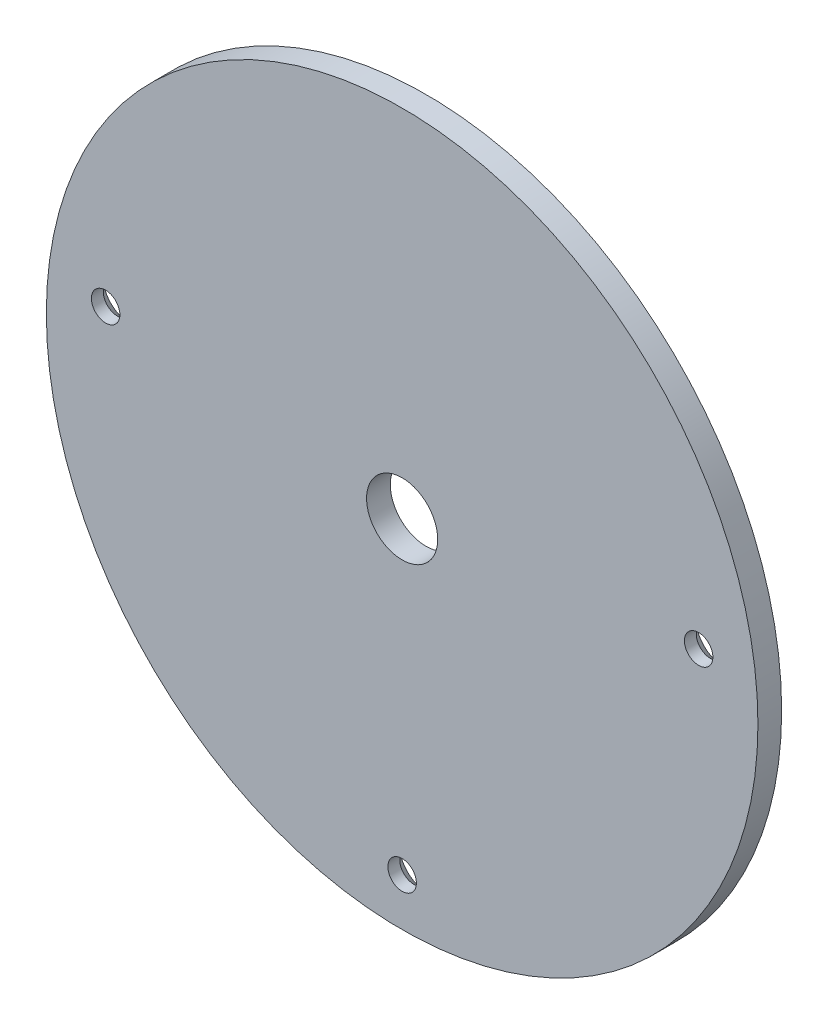
ISO-10303-21;
HEADER;
FILE_DESCRIPTION(('STEP AP214'),'2;1');
FILE_NAME('part.step','',(''),(''),'','','');
FILE_SCHEMA(('AUTOMOTIVE_DESIGN { 1 0 10303 214 1 1 1 1 }'));
ENDSEC;
DATA;
#1=APPLICATION_CONTEXT('core data for automotive mechanical design processes');
#2=APPLICATION_PROTOCOL_DEFINITION('international standard','automotive_design',2000,#1);
#3=PRODUCT_CONTEXT('',#1,'mechanical');
#4=PRODUCT('Part','Part','',(#3));
#5=PRODUCT_RELATED_PRODUCT_CATEGORY('part','',(#4));
#6=PRODUCT_DEFINITION_FORMATION('','',#4);
#7=PRODUCT_DEFINITION_CONTEXT('part definition',#1,'design');
#8=PRODUCT_DEFINITION('design','',#6,#7);
#9=PRODUCT_DEFINITION_SHAPE('','',#8);
#10=(LENGTH_UNIT() NAMED_UNIT(*) SI_UNIT(.MILLI.,.METRE.));
#11=(NAMED_UNIT(*) PLANE_ANGLE_UNIT() SI_UNIT($,.RADIAN.));
#12=(NAMED_UNIT(*) SI_UNIT($,.STERADIAN.) SOLID_ANGLE_UNIT());
#13=UNCERTAINTY_MEASURE_WITH_UNIT(LENGTH_MEASURE(1.E-05),#10,'distance_accuracy_value','');
#14=(GEOMETRIC_REPRESENTATION_CONTEXT(3) GLOBAL_UNCERTAINTY_ASSIGNED_CONTEXT((#13)) GLOBAL_UNIT_ASSIGNED_CONTEXT((#10,
#11,#12)) REPRESENTATION_CONTEXT('',''));
#15=CARTESIAN_POINT('',(0.,0.,0.));
#16=DIRECTION('',(0.,0.,1.));
#17=DIRECTION('',(1.,0.,0.));
#18=AXIS2_PLACEMENT_3D('',#15,#16,#17);
#19=CARTESIAN_POINT('',(0.,0.,2.));
#20=DIRECTION('',(0.,0.,1.));
#21=DIRECTION('',(1.,0.,0.));
#22=AXIS2_PLACEMENT_3D('',#19,#20,#21);
#23=PLANE('',#22);
#24=CARTESIAN_POINT('',(0.,-26.,2.));
#25=DIRECTION('',(0.,0.,1.));
#26=DIRECTION('',(1.,0.,0.));
#27=AXIS2_PLACEMENT_3D('',#24,#25,#26);
#28=CIRCLE('',#27,1.19999999999999);
#29=CARTESIAN_POINT('',(1.19999999999998,-26.,2.));
#30=VERTEX_POINT('',#29);
#31=EDGE_CURVE('E41',#30,#30,#28,.T.);
#32=ORIENTED_EDGE('',*,*,#31,.F.);
#33=EDGE_LOOP('',(#32));
#34=FACE_BOUND('',#33,.T.);
#35=CARTESIAN_POINT('',(25.,3.,2.));
#36=DIRECTION('',(0.,0.,1.));
#37=DIRECTION('',(1.,0.,0.));
#38=AXIS2_PLACEMENT_3D('',#35,#36,#37);
#39=CIRCLE('',#38,1.19999999999999);
#40=CARTESIAN_POINT('',(26.2,3.,2.));
#41=VERTEX_POINT('',#40);
#42=EDGE_CURVE('E62',#41,#41,#39,.T.);
#43=ORIENTED_EDGE('',*,*,#42,.F.);
#44=EDGE_LOOP('',(#43));
#45=FACE_BOUND('',#44,.T.);
#46=CARTESIAN_POINT('',(-25.,3.00000000000001,2.));
#47=DIRECTION('',(0.,0.,1.));
#48=DIRECTION('',(1.,0.,0.));
#49=AXIS2_PLACEMENT_3D('',#46,#47,#48);
#50=CIRCLE('',#49,1.19999999999999);
#51=CARTESIAN_POINT('',(-23.8,3.00000000000001,2.));
#52=VERTEX_POINT('',#51);
#53=EDGE_CURVE('E58',#52,#52,#50,.T.);
#54=ORIENTED_EDGE('',*,*,#53,.F.);
#55=EDGE_LOOP('',(#54));
#56=FACE_BOUND('',#55,.T.);
#57=CARTESIAN_POINT('',(0.,0.,2.));
#58=DIRECTION('',(0.,0.,1.));
#59=DIRECTION('',(1.,0.,0.));
#60=AXIS2_PLACEMENT_3D('',#57,#58,#59);
#61=CIRCLE('',#60,30.);
#62=CARTESIAN_POINT('',(30.,0.,2.));
#63=VERTEX_POINT('',#62);
#64=EDGE_CURVE('E10',#63,#63,#61,.T.);
#65=ORIENTED_EDGE('',*,*,#64,.T.);
#66=EDGE_LOOP('',(#65));
#67=FACE_BOUND('',#66,.T.);
#68=CARTESIAN_POINT('',(0.,0.,2.));
#69=DIRECTION('',(0.,0.,1.));
#70=DIRECTION('',(1.,0.,0.));
#71=AXIS2_PLACEMENT_3D('',#68,#69,#70);
#72=CIRCLE('',#71,3.);
#73=CARTESIAN_POINT('',(3.,0.,2.));
#74=VERTEX_POINT('',#73);
#75=EDGE_CURVE('E52',#74,#74,#72,.T.);
#76=ORIENTED_EDGE('',*,*,#75,.F.);
#77=EDGE_LOOP('',(#76));
#78=FACE_BOUND('',#77,.T.);
#79=ADVANCED_FACE('F37',(#34,#45,#56,#67,#78),#23,.T.);
#80=CARTESIAN_POINT('',(0.,0.,0.));
#81=DIRECTION('',(0.,0.,1.));
#82=DIRECTION('',(1.,0.,0.));
#83=AXIS2_PLACEMENT_3D('',#80,#81,#82);
#84=PLANE('',#83);
#85=CARTESIAN_POINT('',(0.,-26.,0.));
#86=DIRECTION('',(0.,0.,-1.));
#87=DIRECTION('',(-1.,0.,0.));
#88=AXIS2_PLACEMENT_3D('',#85,#86,#87);
#89=CIRCLE('',#88,2.2);
#90=CARTESIAN_POINT('',(-2.20000000000001,-26.,0.));
#91=VERTEX_POINT('',#90);
#92=EDGE_CURVE('E156',#91,#91,#89,.T.);
#93=ORIENTED_EDGE('',*,*,#92,.F.);
#94=EDGE_LOOP('',(#93));
#95=FACE_BOUND('',#94,.T.);
#96=CARTESIAN_POINT('',(25.,3.,0.));
#97=DIRECTION('',(0.,0.,-1.));
#98=DIRECTION('',(-1.,0.,0.));
#99=AXIS2_PLACEMENT_3D('',#96,#97,#98);
#100=CIRCLE('',#99,2.2);
#101=CARTESIAN_POINT('',(22.8,3.,0.));
#102=VERTEX_POINT('',#101);
#103=EDGE_CURVE('E74',#102,#102,#100,.T.);
#104=ORIENTED_EDGE('',*,*,#103,.F.);
#105=EDGE_LOOP('',(#104));
#106=FACE_BOUND('',#105,.T.);
#107=CARTESIAN_POINT('',(-25.,3.00000000000001,0.));
#108=DIRECTION('',(0.,0.,-1.));
#109=DIRECTION('',(-1.,0.,0.));
#110=AXIS2_PLACEMENT_3D('',#107,#108,#109);
#111=CIRCLE('',#110,2.2);
#112=CARTESIAN_POINT('',(-27.2,3.00000000000001,0.));
#113=VERTEX_POINT('',#112);
#114=EDGE_CURVE('E65',#113,#113,#111,.T.);
#115=ORIENTED_EDGE('',*,*,#114,.F.);
#116=EDGE_LOOP('',(#115));
#117=FACE_BOUND('',#116,.T.);
#118=CARTESIAN_POINT('',(0.,0.,0.));
#119=DIRECTION('',(0.,0.,1.));
#120=DIRECTION('',(1.,0.,0.));
#121=AXIS2_PLACEMENT_3D('',#118,#119,#120);
#122=CIRCLE('',#121,30.);
#123=CARTESIAN_POINT('',(30.,0.,0.));
#124=VERTEX_POINT('',#123);
#125=EDGE_CURVE('E46',#124,#124,#122,.T.);
#126=ORIENTED_EDGE('',*,*,#125,.F.);
#127=EDGE_LOOP('',(#126));
#128=FACE_BOUND('',#127,.T.);
#129=CARTESIAN_POINT('',(0.,0.,0.));
#130=DIRECTION('',(0.,0.,1.));
#131=DIRECTION('',(1.,0.,0.));
#132=AXIS2_PLACEMENT_3D('',#129,#130,#131);
#133=CIRCLE('',#132,3.);
#134=CARTESIAN_POINT('',(3.,0.,0.));
#135=VERTEX_POINT('',#134);
#136=EDGE_CURVE('E55',#135,#135,#133,.T.);
#137=ORIENTED_EDGE('',*,*,#136,.T.);
#138=EDGE_LOOP('',(#137));
#139=FACE_BOUND('',#138,.T.);
#140=ADVANCED_FACE('F93',(#95,#106,#117,#128,#139),#84,.F.);
#141=CARTESIAN_POINT('',(0.,0.,2.));
#142=DIRECTION('',(0.,0.,-1.));
#143=DIRECTION('',(-1.,0.,0.));
#144=AXIS2_PLACEMENT_3D('',#141,#142,#143);
#145=CYLINDRICAL_SURFACE('',#144,30.);
#146=ORIENTED_EDGE('',*,*,#64,.F.);
#147=EDGE_LOOP('',(#146));
#148=FACE_BOUND('',#147,.T.);
#149=ORIENTED_EDGE('',*,*,#125,.T.);
#150=EDGE_LOOP('',(#149));
#151=FACE_BOUND('',#150,.T.);
#152=ADVANCED_FACE('F39',(#148,#151),#145,.T.);
#153=CARTESIAN_POINT('',(0.,0.,2.));
#154=DIRECTION('',(0.,0.,-1.));
#155=DIRECTION('',(-1.,0.,0.));
#156=AXIS2_PLACEMENT_3D('',#153,#154,#155);
#157=CYLINDRICAL_SURFACE('',#156,3.);
#158=ORIENTED_EDGE('',*,*,#75,.T.);
#159=EDGE_LOOP('',(#158));
#160=FACE_BOUND('',#159,.T.);
#161=ORIENTED_EDGE('',*,*,#136,.F.);
#162=EDGE_LOOP('',(#161));
#163=FACE_BOUND('',#162,.T.);
#164=ADVANCED_FACE('F95',(#160,#163),#157,.F.);
#165=CARTESIAN_POINT('',(-25.,3.00000000000001,0.));
#166=DIRECTION('',(0.,0.,-1.));
#167=DIRECTION('',(-1.,0.,0.));
#168=AXIS2_PLACEMENT_3D('',#165,#166,#167);
#169=CYLINDRICAL_SURFACE('',#168,1.19999999999999);
#170=ORIENTED_EDGE('',*,*,#53,.T.);
#171=EDGE_LOOP('',(#170));
#172=FACE_BOUND('',#171,.T.);
#173=CARTESIAN_POINT('',(-25.,3.00000000000001,1.));
#174=DIRECTION('',(0.,0.,-1.));
#175=DIRECTION('',(-1.,0.,0.));
#176=AXIS2_PLACEMENT_3D('',#173,#174,#175);
#177=CIRCLE('',#176,1.19999999999999);
#178=CARTESIAN_POINT('',(-26.2,3.00000000000001,1.));
#179=VERTEX_POINT('',#178);
#180=EDGE_CURVE('E61',#179,#179,#177,.T.);
#181=ORIENTED_EDGE('',*,*,#180,.T.);
#182=EDGE_LOOP('',(#181));
#183=FACE_BOUND('',#182,.T.);
#184=ADVANCED_FACE('F97',(#172,#183),#169,.F.);
#185=CARTESIAN_POINT('',(-25.,3.00000000000001,0.));
#186=DIRECTION('',(0.,0.,-1.));
#187=DIRECTION('',(-1.,0.,0.));
#188=AXIS2_PLACEMENT_3D('',#185,#186,#187);
#189=CONICAL_SURFACE('',#188,2.2,0.785398163397453);
#190=ORIENTED_EDGE('',*,*,#180,.F.);
#191=EDGE_LOOP('',(#190));
#192=FACE_BOUND('',#191,.T.);
#193=ORIENTED_EDGE('',*,*,#114,.T.);
#194=EDGE_LOOP('',(#193));
#195=FACE_BOUND('',#194,.T.);
#196=ADVANCED_FACE('F103',(#192,#195),#189,.F.);
#197=CARTESIAN_POINT('',(25.,3.,0.));
#198=DIRECTION('',(0.,0.,-1.));
#199=DIRECTION('',(-1.,0.,0.));
#200=AXIS2_PLACEMENT_3D('',#197,#198,#199);
#201=CYLINDRICAL_SURFACE('',#200,1.19999999999999);
#202=ORIENTED_EDGE('',*,*,#42,.T.);
#203=EDGE_LOOP('',(#202));
#204=FACE_BOUND('',#203,.T.);
#205=CARTESIAN_POINT('',(25.,3.,1.));
#206=DIRECTION('',(0.,0.,-1.));
#207=DIRECTION('',(-1.,0.,0.));
#208=AXIS2_PLACEMENT_3D('',#205,#206,#207);
#209=CIRCLE('',#208,1.19999999999999);
#210=CARTESIAN_POINT('',(23.8,3.,1.));
#211=VERTEX_POINT('',#210);
#212=EDGE_CURVE('E66',#211,#211,#209,.T.);
#213=ORIENTED_EDGE('',*,*,#212,.T.);
#214=EDGE_LOOP('',(#213));
#215=FACE_BOUND('',#214,.T.);
#216=ADVANCED_FACE('F125',(#204,#215),#201,.F.);
#217=CARTESIAN_POINT('',(25.,3.,0.));
#218=DIRECTION('',(0.,0.,-1.));
#219=DIRECTION('',(-1.,0.,0.));
#220=AXIS2_PLACEMENT_3D('',#217,#218,#219);
#221=CONICAL_SURFACE('',#220,2.2,0.785398163397453);
#222=ORIENTED_EDGE('',*,*,#212,.F.);
#223=EDGE_LOOP('',(#222));
#224=FACE_BOUND('',#223,.T.);
#225=ORIENTED_EDGE('',*,*,#103,.T.);
#226=EDGE_LOOP('',(#225));
#227=FACE_BOUND('',#226,.T.);
#228=ADVANCED_FACE('F135',(#224,#227),#221,.F.);
#229=CARTESIAN_POINT('',(0.,-26.,0.));
#230=DIRECTION('',(0.,0.,-1.));
#231=DIRECTION('',(-1.,0.,0.));
#232=AXIS2_PLACEMENT_3D('',#229,#230,#231);
#233=CYLINDRICAL_SURFACE('',#232,1.19999999999999);
#234=ORIENTED_EDGE('',*,*,#31,.T.);
#235=EDGE_LOOP('',(#234));
#236=FACE_BOUND('',#235,.T.);
#237=CARTESIAN_POINT('',(0.,-26.,1.));
#238=DIRECTION('',(0.,0.,-1.));
#239=DIRECTION('',(-1.,0.,0.));
#240=AXIS2_PLACEMENT_3D('',#237,#238,#239);
#241=CIRCLE('',#240,1.19999999999999);
#242=CARTESIAN_POINT('',(-1.2,-26.,1.));
#243=VERTEX_POINT('',#242);
#244=EDGE_CURVE('E153',#243,#243,#241,.T.);
#245=ORIENTED_EDGE('',*,*,#244,.T.);
#246=EDGE_LOOP('',(#245));
#247=FACE_BOUND('',#246,.T.);
#248=ADVANCED_FACE('F140',(#236,#247),#233,.F.);
#249=CARTESIAN_POINT('',(0.,-26.,0.));
#250=DIRECTION('',(0.,0.,-1.));
#251=DIRECTION('',(-1.,0.,0.));
#252=AXIS2_PLACEMENT_3D('',#249,#250,#251);
#253=CONICAL_SURFACE('',#252,2.2,0.785398163397453);
#254=ORIENTED_EDGE('',*,*,#244,.F.);
#255=EDGE_LOOP('',(#254));
#256=FACE_BOUND('',#255,.T.);
#257=ORIENTED_EDGE('',*,*,#92,.T.);
#258=EDGE_LOOP('',(#257));
#259=FACE_BOUND('',#258,.T.);
#260=ADVANCED_FACE('F144',(#256,#259),#253,.F.);
#261=CLOSED_SHELL('',(#79,#140,#152,#164,#184,#196,#216,#228,#248,#260));
#262=MANIFOLD_SOLID_BREP('B2',#261);
#263=ADVANCED_BREP_SHAPE_REPRESENTATION('',(#18,#262),#14);
#264=SHAPE_DEFINITION_REPRESENTATION(#9,#263);
ENDSEC;
END-ISO-10303-21;
